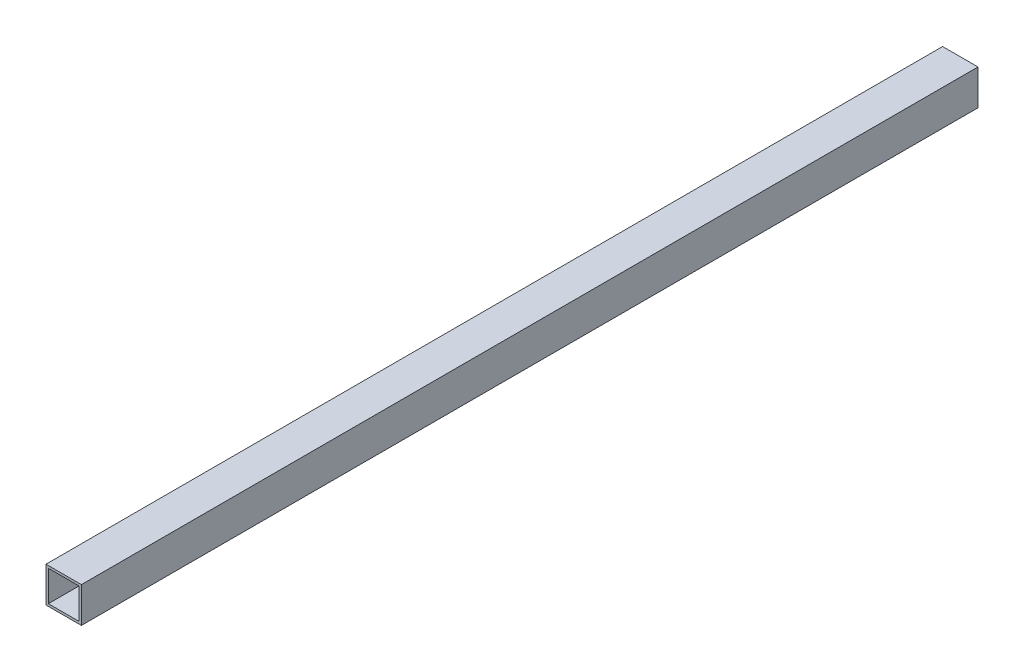
ISO-10303-21;
HEADER;
FILE_DESCRIPTION(('STEP AP214'),'2;1');
FILE_NAME('part.step','',(''),(''),'','','');
FILE_SCHEMA(('AUTOMOTIVE_DESIGN { 1 0 10303 214 1 1 1 1 }'));
ENDSEC;
DATA;
#1=APPLICATION_CONTEXT('core data for automotive mechanical design processes');
#2=APPLICATION_PROTOCOL_DEFINITION('international standard','automotive_design',2000,#1);
#3=PRODUCT_CONTEXT('',#1,'mechanical');
#4=PRODUCT('Part','Part','',(#3));
#5=PRODUCT_RELATED_PRODUCT_CATEGORY('part','',(#4));
#6=PRODUCT_DEFINITION_FORMATION('','',#4);
#7=PRODUCT_DEFINITION_CONTEXT('part definition',#1,'design');
#8=PRODUCT_DEFINITION('design','',#6,#7);
#9=PRODUCT_DEFINITION_SHAPE('','',#8);
#10=(LENGTH_UNIT() NAMED_UNIT(*) SI_UNIT(.MILLI.,.METRE.));
#11=(NAMED_UNIT(*) PLANE_ANGLE_UNIT() SI_UNIT($,.RADIAN.));
#12=(NAMED_UNIT(*) SI_UNIT($,.STERADIAN.) SOLID_ANGLE_UNIT());
#13=UNCERTAINTY_MEASURE_WITH_UNIT(LENGTH_MEASURE(1.E-05),#10,'distance_accuracy_value','');
#14=(GEOMETRIC_REPRESENTATION_CONTEXT(3) GLOBAL_UNCERTAINTY_ASSIGNED_CONTEXT((#13)) GLOBAL_UNIT_ASSIGNED_CONTEXT((#10,
#11,#12)) REPRESENTATION_CONTEXT('',''));
#15=CARTESIAN_POINT('',(0.,0.,0.));
#16=DIRECTION('',(0.,0.,1.));
#17=DIRECTION('',(1.,0.,0.));
#18=AXIS2_PLACEMENT_3D('',#15,#16,#17);
#19=CARTESIAN_POINT('',(0.,0.,482.6));
#20=DIRECTION('',(0.,0.,-1.));
#21=DIRECTION('',(-1.,0.,0.));
#22=AXIS2_PLACEMENT_3D('',#19,#20,#21);
#23=PLANE('',#22);
#24=DIRECTION('',(0.,1.,0.));
#25=VECTOR('',#24,1.);
#26=CARTESIAN_POINT('',(19.05,-19.05,482.6));
#27=LINE('',#26,#25);
#28=CARTESIAN_POINT('',(19.05,-19.05,482.6));
#29=VERTEX_POINT('',#28);
#30=CARTESIAN_POINT('',(19.05,19.05,482.6));
#31=VERTEX_POINT('',#30);
#32=EDGE_CURVE('E168',#29,#31,#27,.T.);
#33=ORIENTED_EDGE('',*,*,#32,.T.);
#34=DIRECTION('',(-1.,0.,0.));
#35=VECTOR('',#34,1.);
#36=CARTESIAN_POINT('',(-19.05,19.05,482.6));
#37=LINE('',#36,#35);
#38=CARTESIAN_POINT('',(-19.05,19.05,482.6));
#39=VERTEX_POINT('',#38);
#40=EDGE_CURVE('E172',#31,#39,#37,.T.);
#41=ORIENTED_EDGE('',*,*,#40,.T.);
#42=DIRECTION('',(0.,-1.,0.));
#43=VECTOR('',#42,1.);
#44=CARTESIAN_POINT('',(-19.05,-19.05,482.6));
#45=LINE('',#44,#43);
#46=CARTESIAN_POINT('',(-19.05,-19.05,482.6));
#47=VERTEX_POINT('',#46);
#48=EDGE_CURVE('E176',#39,#47,#45,.T.);
#49=ORIENTED_EDGE('',*,*,#48,.T.);
#50=DIRECTION('',(1.,0.,0.));
#51=VECTOR('',#50,1.);
#52=CARTESIAN_POINT('',(-19.05,-19.05,482.6));
#53=LINE('',#52,#51);
#54=EDGE_CURVE('E179',#47,#29,#53,.T.);
#55=ORIENTED_EDGE('',*,*,#54,.T.);
#56=EDGE_LOOP('',(#33,#41,#49,#55));
#57=FACE_BOUND('',#56,.T.);
#58=DIRECTION('',(0.,-1.,0.));
#59=VECTOR('',#58,1.);
#60=CARTESIAN_POINT('',(-16.51,-16.51,482.6));
#61=LINE('',#60,#59);
#62=CARTESIAN_POINT('',(-16.51,16.51,482.6));
#63=VERTEX_POINT('',#62);
#64=CARTESIAN_POINT('',(-16.51,-16.51,482.6));
#65=VERTEX_POINT('',#64);
#66=EDGE_CURVE('E119',#63,#65,#61,.T.);
#67=ORIENTED_EDGE('',*,*,#66,.F.);
#68=DIRECTION('',(-1.,0.,0.));
#69=VECTOR('',#68,1.);
#70=CARTESIAN_POINT('',(-16.51,16.51,482.6));
#71=LINE('',#70,#69);
#72=CARTESIAN_POINT('',(16.51,16.51,482.6));
#73=VERTEX_POINT('',#72);
#74=EDGE_CURVE('E146',#73,#63,#71,.T.);
#75=ORIENTED_EDGE('',*,*,#74,.F.);
#76=DIRECTION('',(0.,1.,0.));
#77=VECTOR('',#76,1.);
#78=CARTESIAN_POINT('',(16.51,-16.51,482.6));
#79=LINE('',#78,#77);
#80=CARTESIAN_POINT('',(16.51,-16.51,482.6));
#81=VERTEX_POINT('',#80);
#82=EDGE_CURVE('E141',#81,#73,#79,.T.);
#83=ORIENTED_EDGE('',*,*,#82,.F.);
#84=DIRECTION('',(1.,0.,0.));
#85=VECTOR('',#84,1.);
#86=CARTESIAN_POINT('',(-16.51,-16.51,482.6));
#87=LINE('',#86,#85);
#88=EDGE_CURVE('E128',#65,#81,#87,.T.);
#89=ORIENTED_EDGE('',*,*,#88,.F.);
#90=EDGE_LOOP('',(#67,#75,#83,#89));
#91=FACE_BOUND('',#90,.T.);
#92=ADVANCED_FACE('F39',(#57,#91),#23,.F.);
#93=CARTESIAN_POINT('',(0.,0.,-482.6));
#94=DIRECTION('',(0.,0.,-1.));
#95=DIRECTION('',(-1.,0.,0.));
#96=AXIS2_PLACEMENT_3D('',#93,#94,#95);
#97=PLANE('',#96);
#98=DIRECTION('',(0.,1.,0.));
#99=VECTOR('',#98,1.);
#100=CARTESIAN_POINT('',(19.05,-19.05,-482.6));
#101=LINE('',#100,#99);
#102=CARTESIAN_POINT('',(19.05,-19.05,-482.6));
#103=VERTEX_POINT('',#102);
#104=CARTESIAN_POINT('',(19.05,19.05,-482.6));
#105=VERTEX_POINT('',#104);
#106=EDGE_CURVE('E137',#103,#105,#101,.T.);
#107=ORIENTED_EDGE('',*,*,#106,.F.);
#108=DIRECTION('',(1.,0.,0.));
#109=VECTOR('',#108,1.);
#110=CARTESIAN_POINT('',(-19.05,-19.05,-482.6));
#111=LINE('',#110,#109);
#112=CARTESIAN_POINT('',(-19.05,-19.05,-482.6));
#113=VERTEX_POINT('',#112);
#114=EDGE_CURVE('E173',#113,#103,#111,.T.);
#115=ORIENTED_EDGE('',*,*,#114,.F.);
#116=DIRECTION('',(0.,-1.,0.));
#117=VECTOR('',#116,1.);
#118=CARTESIAN_POINT('',(-19.05,-19.05,-482.6));
#119=LINE('',#118,#117);
#120=CARTESIAN_POINT('',(-19.05,19.05,-482.6));
#121=VERTEX_POINT('',#120);
#122=EDGE_CURVE('E188',#121,#113,#119,.T.);
#123=ORIENTED_EDGE('',*,*,#122,.F.);
#124=DIRECTION('',(-1.,0.,0.));
#125=VECTOR('',#124,1.);
#126=CARTESIAN_POINT('',(-19.05,19.05,-482.6));
#127=LINE('',#126,#125);
#128=EDGE_CURVE('E185',#105,#121,#127,.T.);
#129=ORIENTED_EDGE('',*,*,#128,.F.);
#130=EDGE_LOOP('',(#107,#115,#123,#129));
#131=FACE_BOUND('',#130,.T.);
#132=DIRECTION('',(-1.,0.,0.));
#133=VECTOR('',#132,1.);
#134=CARTESIAN_POINT('',(-16.51,16.51,-482.6));
#135=LINE('',#134,#133);
#136=CARTESIAN_POINT('',(16.51,16.51,-482.6));
#137=VERTEX_POINT('',#136);
#138=CARTESIAN_POINT('',(-16.51,16.51,-482.6));
#139=VERTEX_POINT('',#138);
#140=EDGE_CURVE('E129',#137,#139,#135,.T.);
#141=ORIENTED_EDGE('',*,*,#140,.T.);
#142=DIRECTION('',(0.,-1.,0.));
#143=VECTOR('',#142,1.);
#144=CARTESIAN_POINT('',(-16.51,-16.51,-482.6));
#145=LINE('',#144,#143);
#146=CARTESIAN_POINT('',(-16.51,-16.51,-482.6));
#147=VERTEX_POINT('',#146);
#148=EDGE_CURVE('E66',#139,#147,#145,.T.);
#149=ORIENTED_EDGE('',*,*,#148,.T.);
#150=DIRECTION('',(1.,0.,0.));
#151=VECTOR('',#150,1.);
#152=CARTESIAN_POINT('',(-16.51,-16.51,-482.6));
#153=LINE('',#152,#151);
#154=CARTESIAN_POINT('',(16.51,-16.51,-482.6));
#155=VERTEX_POINT('',#154);
#156=EDGE_CURVE('E135',#147,#155,#153,.T.);
#157=ORIENTED_EDGE('',*,*,#156,.T.);
#158=DIRECTION('',(0.,1.,0.));
#159=VECTOR('',#158,1.);
#160=CARTESIAN_POINT('',(16.51,-16.51,-482.6));
#161=LINE('',#160,#159);
#162=EDGE_CURVE('E155',#155,#137,#161,.T.);
#163=ORIENTED_EDGE('',*,*,#162,.T.);
#164=EDGE_LOOP('',(#141,#149,#157,#163));
#165=FACE_BOUND('',#164,.T.);
#166=ADVANCED_FACE('F211',(#131,#165),#97,.T.);
#167=CARTESIAN_POINT('',(19.05,-19.05,482.6));
#168=DIRECTION('',(-1.,0.,0.));
#169=DIRECTION('',(0.,0.,1.));
#170=AXIS2_PLACEMENT_3D('',#167,#168,#169);
#171=PLANE('',#170);
#172=ORIENTED_EDGE('',*,*,#106,.T.);
#173=DIRECTION('',(0.,0.,-1.));
#174=VECTOR('',#173,1.);
#175=CARTESIAN_POINT('',(19.05,19.05,482.6));
#176=LINE('',#175,#174);
#177=EDGE_CURVE('E11',#31,#105,#176,.T.);
#178=ORIENTED_EDGE('',*,*,#177,.F.);
#179=ORIENTED_EDGE('',*,*,#32,.F.);
#180=DIRECTION('',(0.,0.,-1.));
#181=VECTOR('',#180,1.);
#182=CARTESIAN_POINT('',(19.05,-19.05,482.6));
#183=LINE('',#182,#181);
#184=EDGE_CURVE('E181',#29,#103,#183,.T.);
#185=ORIENTED_EDGE('',*,*,#184,.T.);
#186=EDGE_LOOP('',(#172,#178,#179,#185));
#187=FACE_BOUND('',#186,.T.);
#188=ADVANCED_FACE('F41',(#187),#171,.F.);
#189=CARTESIAN_POINT('',(-19.05,19.05,482.6));
#190=DIRECTION('',(0.,-1.,0.));
#191=DIRECTION('',(0.,0.,-1.));
#192=AXIS2_PLACEMENT_3D('',#189,#190,#191);
#193=PLANE('',#192);
#194=ORIENTED_EDGE('',*,*,#128,.T.);
#195=DIRECTION('',(0.,0.,-1.));
#196=VECTOR('',#195,1.);
#197=CARTESIAN_POINT('',(-19.05,19.05,482.6));
#198=LINE('',#197,#196);
#199=EDGE_CURVE('E48',#39,#121,#198,.T.);
#200=ORIENTED_EDGE('',*,*,#199,.F.);
#201=ORIENTED_EDGE('',*,*,#40,.F.);
#202=ORIENTED_EDGE('',*,*,#177,.T.);
#203=EDGE_LOOP('',(#194,#200,#201,#202));
#204=FACE_BOUND('',#203,.T.);
#205=ADVANCED_FACE('F221',(#204),#193,.F.);
#206=CARTESIAN_POINT('',(-19.05,-19.05,482.6));
#207=DIRECTION('',(1.,0.,0.));
#208=DIRECTION('',(0.,0.,-1.));
#209=AXIS2_PLACEMENT_3D('',#206,#207,#208);
#210=PLANE('',#209);
#211=ORIENTED_EDGE('',*,*,#122,.T.);
#212=DIRECTION('',(0.,0.,-1.));
#213=VECTOR('',#212,1.);
#214=CARTESIAN_POINT('',(-19.05,-19.05,482.6));
#215=LINE('',#214,#213);
#216=EDGE_CURVE('E196',#47,#113,#215,.T.);
#217=ORIENTED_EDGE('',*,*,#216,.F.);
#218=ORIENTED_EDGE('',*,*,#48,.F.);
#219=ORIENTED_EDGE('',*,*,#199,.T.);
#220=EDGE_LOOP('',(#211,#217,#218,#219));
#221=FACE_BOUND('',#220,.T.);
#222=ADVANCED_FACE('F205',(#221),#210,.F.);
#223=CARTESIAN_POINT('',(-19.05,-19.05,482.6));
#224=DIRECTION('',(0.,1.,0.));
#225=DIRECTION('',(0.,0.,1.));
#226=AXIS2_PLACEMENT_3D('',#223,#224,#225);
#227=PLANE('',#226);
#228=ORIENTED_EDGE('',*,*,#114,.T.);
#229=ORIENTED_EDGE('',*,*,#184,.F.);
#230=ORIENTED_EDGE('',*,*,#54,.F.);
#231=ORIENTED_EDGE('',*,*,#216,.T.);
#232=EDGE_LOOP('',(#228,#229,#230,#231));
#233=FACE_BOUND('',#232,.T.);
#234=ADVANCED_FACE('F215',(#233),#227,.F.);
#235=CARTESIAN_POINT('',(-16.51,-16.51,482.6));
#236=DIRECTION('',(1.,0.,0.));
#237=DIRECTION('',(0.,0.,-1.));
#238=AXIS2_PLACEMENT_3D('',#235,#236,#237);
#239=PLANE('',#238);
#240=ORIENTED_EDGE('',*,*,#148,.F.);
#241=DIRECTION('',(0.,0.,-1.));
#242=VECTOR('',#241,1.);
#243=CARTESIAN_POINT('',(-16.51,16.51,482.6));
#244=LINE('',#243,#242);
#245=EDGE_CURVE('E123',#63,#139,#244,.T.);
#246=ORIENTED_EDGE('',*,*,#245,.F.);
#247=ORIENTED_EDGE('',*,*,#66,.T.);
#248=DIRECTION('',(0.,0.,-1.));
#249=VECTOR('',#248,1.);
#250=CARTESIAN_POINT('',(-16.51,-16.51,482.6));
#251=LINE('',#250,#249);
#252=EDGE_CURVE('E122',#65,#147,#251,.T.);
#253=ORIENTED_EDGE('',*,*,#252,.T.);
#254=EDGE_LOOP('',(#240,#246,#247,#253));
#255=FACE_BOUND('',#254,.T.);
#256=ADVANCED_FACE('F121',(#255),#239,.T.);
#257=CARTESIAN_POINT('',(-16.51,-16.51,482.6));
#258=DIRECTION('',(0.,1.,0.));
#259=DIRECTION('',(0.,0.,1.));
#260=AXIS2_PLACEMENT_3D('',#257,#258,#259);
#261=PLANE('',#260);
#262=ORIENTED_EDGE('',*,*,#156,.F.);
#263=ORIENTED_EDGE('',*,*,#252,.F.);
#264=ORIENTED_EDGE('',*,*,#88,.T.);
#265=DIRECTION('',(0.,0.,-1.));
#266=VECTOR('',#265,1.);
#267=CARTESIAN_POINT('',(16.51,-16.51,482.6));
#268=LINE('',#267,#266);
#269=EDGE_CURVE('E138',#81,#155,#268,.T.);
#270=ORIENTED_EDGE('',*,*,#269,.T.);
#271=EDGE_LOOP('',(#262,#263,#264,#270));
#272=FACE_BOUND('',#271,.T.);
#273=ADVANCED_FACE('F132',(#272),#261,.T.);
#274=CARTESIAN_POINT('',(16.51,-16.51,482.6));
#275=DIRECTION('',(-1.,0.,0.));
#276=DIRECTION('',(0.,0.,1.));
#277=AXIS2_PLACEMENT_3D('',#274,#275,#276);
#278=PLANE('',#277);
#279=ORIENTED_EDGE('',*,*,#162,.F.);
#280=ORIENTED_EDGE('',*,*,#269,.F.);
#281=ORIENTED_EDGE('',*,*,#82,.T.);
#282=DIRECTION('',(0.,0.,-1.));
#283=VECTOR('',#282,1.);
#284=CARTESIAN_POINT('',(16.51,16.51,482.6));
#285=LINE('',#284,#283);
#286=EDGE_CURVE('E58',#73,#137,#285,.T.);
#287=ORIENTED_EDGE('',*,*,#286,.T.);
#288=EDGE_LOOP('',(#279,#280,#281,#287));
#289=FACE_BOUND('',#288,.T.);
#290=ADVANCED_FACE('F244',(#289),#278,.T.);
#291=CARTESIAN_POINT('',(-16.51,16.51,482.6));
#292=DIRECTION('',(0.,-1.,0.));
#293=DIRECTION('',(0.,0.,-1.));
#294=AXIS2_PLACEMENT_3D('',#291,#292,#293);
#295=PLANE('',#294);
#296=ORIENTED_EDGE('',*,*,#140,.F.);
#297=ORIENTED_EDGE('',*,*,#286,.F.);
#298=ORIENTED_EDGE('',*,*,#74,.T.);
#299=ORIENTED_EDGE('',*,*,#245,.T.);
#300=EDGE_LOOP('',(#296,#297,#298,#299));
#301=FACE_BOUND('',#300,.T.);
#302=ADVANCED_FACE('F248',(#301),#295,.T.);
#303=CLOSED_SHELL('',(#92,#166,#188,#205,#222,#234,#256,#273,#290,#302));
#304=MANIFOLD_SOLID_BREP('B2',#303);
#305=ADVANCED_BREP_SHAPE_REPRESENTATION('',(#18,#304),#14);
#306=SHAPE_DEFINITION_REPRESENTATION(#9,#305);
ENDSEC;
END-ISO-10303-21;
